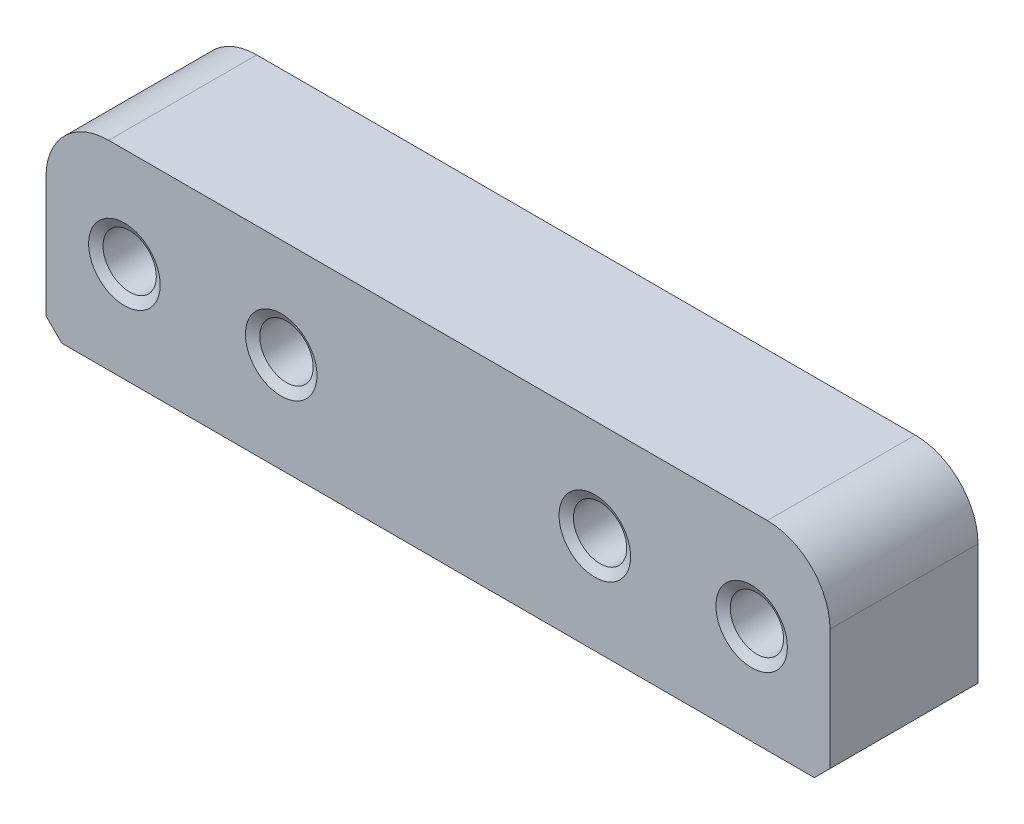
ISO-10303-21;
HEADER;
FILE_DESCRIPTION(('STEP AP214'),'2;1');
FILE_NAME('part.step','',(''),(''),'','','');
FILE_SCHEMA(('AUTOMOTIVE_DESIGN { 1 0 10303 214 1 1 1 1 }'));
ENDSEC;
DATA;
#1=APPLICATION_CONTEXT('core data for automotive mechanical design processes');
#2=APPLICATION_PROTOCOL_DEFINITION('international standard','automotive_design',2000,#1);
#3=PRODUCT_CONTEXT('',#1,'mechanical');
#4=PRODUCT('Part','Part','',(#3));
#5=PRODUCT_RELATED_PRODUCT_CATEGORY('part','',(#4));
#6=PRODUCT_DEFINITION_FORMATION('','',#4);
#7=PRODUCT_DEFINITION_CONTEXT('part definition',#1,'design');
#8=PRODUCT_DEFINITION('design','',#6,#7);
#9=PRODUCT_DEFINITION_SHAPE('','',#8);
#10=(LENGTH_UNIT() NAMED_UNIT(*) SI_UNIT(.MILLI.,.METRE.));
#11=(NAMED_UNIT(*) PLANE_ANGLE_UNIT() SI_UNIT($,.RADIAN.));
#12=(NAMED_UNIT(*) SI_UNIT($,.STERADIAN.) SOLID_ANGLE_UNIT());
#13=UNCERTAINTY_MEASURE_WITH_UNIT(LENGTH_MEASURE(1.E-05),#10,'distance_accuracy_value','');
#14=(GEOMETRIC_REPRESENTATION_CONTEXT(3) GLOBAL_UNCERTAINTY_ASSIGNED_CONTEXT((#13)) GLOBAL_UNIT_ASSIGNED_CONTEXT((#10,
#11,#12)) REPRESENTATION_CONTEXT('',''));
#15=CARTESIAN_POINT('',(0.,0.,0.));
#16=DIRECTION('',(0.,0.,1.));
#17=DIRECTION('',(1.,0.,0.));
#18=AXIS2_PLACEMENT_3D('',#15,#16,#17);
#19=CARTESIAN_POINT('',(476.510652388512,-35.6945033639548,-954.200431195112));
#20=DIRECTION('',(0.,0.,-1.));
#21=DIRECTION('',(-1.,0.,0.));
#22=AXIS2_PLACEMENT_3D('',#19,#20,#21);
#23=PLANE('',#22);
#24=CARTESIAN_POINT('',(456.510652388512,-35.6945033639549,-954.200431195112));
#25=DIRECTION('',(0.,0.,1.));
#26=DIRECTION('',(1.,0.,0.));
#27=AXIS2_PLACEMENT_3D('',#24,#25,#26);
#28=CIRCLE('',#27,3.4);
#29=CARTESIAN_POINT('',(459.910652388512,-35.6945033639549,-954.200431195112));
#30=VERTEX_POINT('',#29);
#31=EDGE_CURVE('E232',#30,#30,#28,.T.);
#32=ORIENTED_EDGE('',*,*,#31,.T.);
#33=EDGE_LOOP('',(#32));
#34=FACE_BOUND('',#33,.T.);
#35=CARTESIAN_POINT('',(456.510652388512,-35.6945033639549,-954.200431195112));
#36=DIRECTION('',(0.,0.,-1.));
#37=DIRECTION('',(-1.,0.,0.));
#38=AXIS2_PLACEMENT_3D('',#35,#36,#37);
#39=CIRCLE('',#38,4.25);
#40=CARTESIAN_POINT('',(452.260652388512,-35.6945033639549,-954.200431195112));
#41=VERTEX_POINT('',#40);
#42=EDGE_CURVE('E240',#41,#41,#39,.T.);
#43=ORIENTED_EDGE('',*,*,#42,.T.);
#44=EDGE_LOOP('',(#43));
#45=FACE_BOUND('',#44,.T.);
#46=ADVANCED_FACE('F17',(#34,#45),#23,.T.);
#47=CARTESIAN_POINT('',(476.510652388512,-35.6945033639548,-954.200431195112));
#48=DIRECTION('',(0.,0.,-1.));
#49=DIRECTION('',(-1.,0.,0.));
#50=AXIS2_PLACEMENT_3D('',#47,#48,#49);
#51=PLANE('',#50);
#52=CARTESIAN_POINT('',(496.510652388511,-35.6945033639549,-954.200431195112));
#53=DIRECTION('',(0.,0.,1.));
#54=DIRECTION('',(1.,0.,0.));
#55=AXIS2_PLACEMENT_3D('',#52,#53,#54);
#56=CIRCLE('',#55,3.4);
#57=CARTESIAN_POINT('',(499.910652388511,-35.6945033639549,-954.200431195112));
#58=VERTEX_POINT('',#57);
#59=EDGE_CURVE('E229',#58,#58,#56,.T.);
#60=ORIENTED_EDGE('',*,*,#59,.T.);
#61=EDGE_LOOP('',(#60));
#62=FACE_BOUND('',#61,.T.);
#63=CARTESIAN_POINT('',(496.510652388511,-35.6945033639549,-954.200431195112));
#64=DIRECTION('',(0.,0.,-1.));
#65=DIRECTION('',(-1.,0.,0.));
#66=AXIS2_PLACEMENT_3D('',#63,#64,#65);
#67=CIRCLE('',#66,4.25);
#68=CARTESIAN_POINT('',(492.260652388511,-35.6945033639549,-954.200431195112));
#69=VERTEX_POINT('',#68);
#70=EDGE_CURVE('E235',#69,#69,#67,.T.);
#71=ORIENTED_EDGE('',*,*,#70,.T.);
#72=EDGE_LOOP('',(#71));
#73=FACE_BOUND('',#72,.T.);
#74=ADVANCED_FACE('F347',(#62,#73),#51,.T.);
#75=CARTESIAN_POINT('',(476.510652388512,-35.6945033639548,-954.200431195112));
#76=DIRECTION('',(0.,0.,-1.));
#77=DIRECTION('',(-1.,0.,0.));
#78=AXIS2_PLACEMENT_3D('',#75,#76,#77);
#79=PLANE('',#78);
#80=CARTESIAN_POINT('',(436.510652388512,-35.6945033639549,-954.200431195112));
#81=DIRECTION('',(0.,0.,1.));
#82=DIRECTION('',(1.,0.,0.));
#83=AXIS2_PLACEMENT_3D('',#80,#81,#82);
#84=CIRCLE('',#83,3.4);
#85=CARTESIAN_POINT('',(439.910652388512,-35.6945033639549,-954.200431195112));
#86=VERTEX_POINT('',#85);
#87=EDGE_CURVE('E226',#86,#86,#84,.T.);
#88=ORIENTED_EDGE('',*,*,#87,.T.);
#89=EDGE_LOOP('',(#88));
#90=FACE_BOUND('',#89,.T.);
#91=CARTESIAN_POINT('',(436.510652388512,-35.6945033639549,-954.200431195112));
#92=DIRECTION('',(0.,0.,-1.));
#93=DIRECTION('',(-1.,0.,0.));
#94=AXIS2_PLACEMENT_3D('',#91,#92,#93);
#95=CIRCLE('',#94,4.25);
#96=CARTESIAN_POINT('',(432.260652388512,-35.6945033639549,-954.200431195112));
#97=VERTEX_POINT('',#96);
#98=EDGE_CURVE('E238',#97,#97,#95,.T.);
#99=ORIENTED_EDGE('',*,*,#98,.T.);
#100=EDGE_LOOP('',(#99));
#101=FACE_BOUND('',#100,.T.);
#102=ADVANCED_FACE('F262',(#90,#101),#79,.T.);
#103=CARTESIAN_POINT('',(476.510652388512,-35.6945033639548,-954.200431195112));
#104=DIRECTION('',(0.,0.,-1.));
#105=DIRECTION('',(-1.,0.,0.));
#106=AXIS2_PLACEMENT_3D('',#103,#104,#105);
#107=PLANE('',#106);
#108=CARTESIAN_POINT('',(516.510652388511,-35.6945033639549,-954.200431195112));
#109=DIRECTION('',(0.,0.,1.));
#110=DIRECTION('',(1.,0.,0.));
#111=AXIS2_PLACEMENT_3D('',#108,#109,#110);
#112=CIRCLE('',#111,3.4);
#113=CARTESIAN_POINT('',(519.910652388511,-35.6945033639549,-954.200431195112));
#114=VERTEX_POINT('',#113);
#115=EDGE_CURVE('E223',#114,#114,#112,.T.);
#116=ORIENTED_EDGE('',*,*,#115,.T.);
#117=EDGE_LOOP('',(#116));
#118=FACE_BOUND('',#117,.T.);
#119=CARTESIAN_POINT('',(516.510652388511,-35.6945033639549,-954.200431195112));
#120=DIRECTION('',(0.,0.,-1.));
#121=DIRECTION('',(-1.,0.,0.));
#122=AXIS2_PLACEMENT_3D('',#119,#120,#121);
#123=CIRCLE('',#122,4.25);
#124=CARTESIAN_POINT('',(512.260652388511,-35.6945033639549,-954.200431195112));
#125=VERTEX_POINT('',#124);
#126=EDGE_CURVE('E20',#125,#125,#123,.T.);
#127=ORIENTED_EDGE('',*,*,#126,.T.);
#128=EDGE_LOOP('',(#127));
#129=FACE_BOUND('',#128,.T.);
#130=ADVANCED_FACE('F247',(#118,#129),#107,.T.);
#131=CARTESIAN_POINT('',(516.510652388511,-35.6945033639549,-965.200431195112));
#132=DIRECTION('',(0.,0.,-1.));
#133=DIRECTION('',(-1.,0.,0.));
#134=AXIS2_PLACEMENT_3D('',#131,#132,#133);
#135=CYLINDRICAL_SURFACE('',#134,4.25);
#136=CARTESIAN_POINT('',(516.510652388511,-35.6945033639549,-965.200431195112));
#137=DIRECTION('',(0.,0.,-1.));
#138=DIRECTION('',(-1.,0.,0.));
#139=AXIS2_PLACEMENT_3D('',#136,#137,#138);
#140=CIRCLE('',#139,4.25);
#141=CARTESIAN_POINT('',(512.260652388511,-35.6945033639549,-965.200431195112));
#142=VERTEX_POINT('',#141);
#143=EDGE_CURVE('E220',#142,#142,#140,.T.);
#144=ORIENTED_EDGE('',*,*,#143,.T.);
#145=EDGE_LOOP('',(#144));
#146=FACE_BOUND('',#145,.T.);
#147=ORIENTED_EDGE('',*,*,#126,.F.);
#148=EDGE_LOOP('',(#147));
#149=FACE_BOUND('',#148,.T.);
#150=ADVANCED_FACE('F249',(#146,#149),#135,.F.);
#151=CARTESIAN_POINT('',(456.510652388512,-35.6945033639549,-965.200431195112));
#152=DIRECTION('',(0.,0.,-1.));
#153=DIRECTION('',(-1.,0.,0.));
#154=AXIS2_PLACEMENT_3D('',#151,#152,#153);
#155=CYLINDRICAL_SURFACE('',#154,4.25);
#156=CARTESIAN_POINT('',(456.510652388512,-35.6945033639549,-965.200431195112));
#157=DIRECTION('',(0.,0.,-1.));
#158=DIRECTION('',(-1.,0.,0.));
#159=AXIS2_PLACEMENT_3D('',#156,#157,#158);
#160=CIRCLE('',#159,4.25);
#161=CARTESIAN_POINT('',(452.260652388512,-35.6945033639549,-965.200431195112));
#162=VERTEX_POINT('',#161);
#163=EDGE_CURVE('E217',#162,#162,#160,.T.);
#164=ORIENTED_EDGE('',*,*,#163,.T.);
#165=EDGE_LOOP('',(#164));
#166=FACE_BOUND('',#165,.T.);
#167=ORIENTED_EDGE('',*,*,#42,.F.);
#168=EDGE_LOOP('',(#167));
#169=FACE_BOUND('',#168,.T.);
#170=ADVANCED_FACE('F251',(#166,#169),#155,.F.);
#171=CARTESIAN_POINT('',(436.510652388512,-35.6945033639549,-965.200431195112));
#172=DIRECTION('',(0.,0.,-1.));
#173=DIRECTION('',(-1.,0.,0.));
#174=AXIS2_PLACEMENT_3D('',#171,#172,#173);
#175=CYLINDRICAL_SURFACE('',#174,4.25);
#176=CARTESIAN_POINT('',(436.510652388512,-35.6945033639549,-965.200431195112));
#177=DIRECTION('',(0.,0.,-1.));
#178=DIRECTION('',(-1.,0.,0.));
#179=AXIS2_PLACEMENT_3D('',#176,#177,#178);
#180=CIRCLE('',#179,4.25);
#181=CARTESIAN_POINT('',(432.260652388512,-35.6945033639549,-965.200431195112));
#182=VERTEX_POINT('',#181);
#183=EDGE_CURVE('E214',#182,#182,#180,.T.);
#184=ORIENTED_EDGE('',*,*,#183,.T.);
#185=EDGE_LOOP('',(#184));
#186=FACE_BOUND('',#185,.T.);
#187=ORIENTED_EDGE('',*,*,#98,.F.);
#188=EDGE_LOOP('',(#187));
#189=FACE_BOUND('',#188,.T.);
#190=ADVANCED_FACE('F259',(#186,#189),#175,.F.);
#191=CARTESIAN_POINT('',(496.510652388511,-35.6945033639549,-965.200431195112));
#192=DIRECTION('',(0.,0.,-1.));
#193=DIRECTION('',(-1.,0.,0.));
#194=AXIS2_PLACEMENT_3D('',#191,#192,#193);
#195=CYLINDRICAL_SURFACE('',#194,4.25);
#196=CARTESIAN_POINT('',(496.510652388511,-35.6945033639549,-965.200431195112));
#197=DIRECTION('',(0.,0.,-1.));
#198=DIRECTION('',(-1.,0.,0.));
#199=AXIS2_PLACEMENT_3D('',#196,#197,#198);
#200=CIRCLE('',#199,4.25);
#201=CARTESIAN_POINT('',(492.260652388511,-35.6945033639549,-965.200431195112));
#202=VERTEX_POINT('',#201);
#203=EDGE_CURVE('E173',#202,#202,#200,.T.);
#204=ORIENTED_EDGE('',*,*,#203,.T.);
#205=EDGE_LOOP('',(#204));
#206=FACE_BOUND('',#205,.T.);
#207=ORIENTED_EDGE('',*,*,#70,.F.);
#208=EDGE_LOOP('',(#207));
#209=FACE_BOUND('',#208,.T.);
#210=ADVANCED_FACE('F333',(#206,#209),#195,.F.);
#211=CARTESIAN_POINT('',(456.510652388512,-35.6945033639549,-949.325431195112));
#212=DIRECTION('',(0.,0.,1.));
#213=DIRECTION('',(1.,0.,0.));
#214=AXIS2_PLACEMENT_3D('',#211,#212,#213);
#215=CYLINDRICAL_SURFACE('',#214,3.4);
#216=CARTESIAN_POINT('',(456.510652388512,-35.6945033639549,-946.99660088304));
#217=DIRECTION('',(0.,0.,1.));
#218=DIRECTION('',(0.,1.,0.));
#219=AXIS2_PLACEMENT_3D('',#216,#217,#218);
#220=CIRCLE('',#219,3.39999999998369);
#221=CARTESIAN_POINT('',(456.510652388512,-32.2945033639712,-946.99660088304));
#222=VERTEX_POINT('',#221);
#223=EDGE_CURVE('E172',#222,#222,#220,.T.);
#224=ORIENTED_EDGE('',*,*,#223,.T.);
#225=EDGE_LOOP('',(#224));
#226=FACE_BOUND('',#225,.T.);
#227=ORIENTED_EDGE('',*,*,#31,.F.);
#228=EDGE_LOOP('',(#227));
#229=FACE_BOUND('',#228,.T.);
#230=ADVANCED_FACE('F329',(#226,#229),#215,.F.);
#231=CARTESIAN_POINT('',(496.510652388511,-35.6945033639549,-949.325431195112));
#232=DIRECTION('',(0.,0.,1.));
#233=DIRECTION('',(1.,0.,0.));
#234=AXIS2_PLACEMENT_3D('',#231,#232,#233);
#235=CYLINDRICAL_SURFACE('',#234,3.4);
#236=CARTESIAN_POINT('',(496.510652388511,-35.6945033639549,-946.99660088304));
#237=DIRECTION('',(0.,0.,1.));
#238=DIRECTION('',(0.,1.,0.));
#239=AXIS2_PLACEMENT_3D('',#236,#237,#238);
#240=CIRCLE('',#239,3.39999999998369);
#241=CARTESIAN_POINT('',(496.510652388511,-32.2945033639712,-946.99660088304));
#242=VERTEX_POINT('',#241);
#243=EDGE_CURVE('E192',#242,#242,#240,.T.);
#244=ORIENTED_EDGE('',*,*,#243,.T.);
#245=EDGE_LOOP('',(#244));
#246=FACE_BOUND('',#245,.T.);
#247=ORIENTED_EDGE('',*,*,#59,.F.);
#248=EDGE_LOOP('',(#247));
#249=FACE_BOUND('',#248,.T.);
#250=ADVANCED_FACE('F325',(#246,#249),#235,.F.);
#251=CARTESIAN_POINT('',(436.510652388512,-35.6945033639549,-949.325431195112));
#252=DIRECTION('',(0.,0.,1.));
#253=DIRECTION('',(1.,0.,0.));
#254=AXIS2_PLACEMENT_3D('',#251,#252,#253);
#255=CYLINDRICAL_SURFACE('',#254,3.4);
#256=CARTESIAN_POINT('',(436.510652388512,-35.6945033639549,-946.99660088304));
#257=DIRECTION('',(0.,0.,1.));
#258=DIRECTION('',(0.,1.,0.));
#259=AXIS2_PLACEMENT_3D('',#256,#257,#258);
#260=CIRCLE('',#259,3.39999999998369);
#261=CARTESIAN_POINT('',(436.510652388512,-32.2945033639712,-946.99660088304));
#262=VERTEX_POINT('',#261);
#263=EDGE_CURVE('E189',#262,#262,#260,.T.);
#264=ORIENTED_EDGE('',*,*,#263,.T.);
#265=EDGE_LOOP('',(#264));
#266=FACE_BOUND('',#265,.T.);
#267=ORIENTED_EDGE('',*,*,#87,.F.);
#268=EDGE_LOOP('',(#267));
#269=FACE_BOUND('',#268,.T.);
#270=ADVANCED_FACE('F321',(#266,#269),#255,.F.);
#271=CARTESIAN_POINT('',(516.510652388511,-35.6945033639549,-949.325431195112));
#272=DIRECTION('',(0.,0.,1.));
#273=DIRECTION('',(1.,0.,0.));
#274=AXIS2_PLACEMENT_3D('',#271,#272,#273);
#275=CYLINDRICAL_SURFACE('',#274,3.4);
#276=CARTESIAN_POINT('',(516.510652388511,-35.6945033639549,-946.99660088304));
#277=DIRECTION('',(0.,0.,1.));
#278=DIRECTION('',(0.,1.,0.));
#279=AXIS2_PLACEMENT_3D('',#276,#277,#278);
#280=CIRCLE('',#279,3.39999999998369);
#281=CARTESIAN_POINT('',(516.510652388511,-32.2945033639712,-946.99660088304));
#282=VERTEX_POINT('',#281);
#283=EDGE_CURVE('E186',#282,#282,#280,.T.);
#284=ORIENTED_EDGE('',*,*,#283,.T.);
#285=EDGE_LOOP('',(#284));
#286=FACE_BOUND('',#285,.T.);
#287=ORIENTED_EDGE('',*,*,#115,.F.);
#288=EDGE_LOOP('',(#287));
#289=FACE_BOUND('',#288,.T.);
#290=ADVANCED_FACE('F318',(#286,#289),#275,.F.);
#291=CARTESIAN_POINT('',(476.510652388512,-47.3945033639549,-964.200431195112));
#292=DIRECTION('',(0.,0.707106781186548,0.707106781186548));
#293=DIRECTION('',(0.,-0.707106781186548,0.707106781186548));
#294=AXIS2_PLACEMENT_3D('',#291,#292,#293);
#295=PLANE('',#294);
#296=DIRECTION('',(-0.577350269189626,0.577350269189626,-0.577350269189626));
#297=VECTOR('',#296,1.);
#298=CARTESIAN_POINT('',(428.510652388512,-48.3945033639549,-963.200431195112));
#299=LINE('',#298,#297);
#300=CARTESIAN_POINT('',(428.510652388512,-48.3945033639549,-963.200431195112));
#301=VERTEX_POINT('',#300);
#302=CARTESIAN_POINT('',(426.510652388512,-46.3945033639549,-965.200431195112));
#303=VERTEX_POINT('',#302);
#304=EDGE_CURVE('E150',#301,#303,#299,.T.);
#305=ORIENTED_EDGE('',*,*,#304,.T.);
#306=DIRECTION('',(1.,0.,0.));
#307=VECTOR('',#306,1.);
#308=CARTESIAN_POINT('',(526.510652388511,-46.3945033639549,-965.200431195112));
#309=LINE('',#308,#307);
#310=CARTESIAN_POINT('',(526.510652388511,-46.3945033639549,-965.200431195112));
#311=VERTEX_POINT('',#310);
#312=EDGE_CURVE('E68',#303,#311,#309,.T.);
#313=ORIENTED_EDGE('',*,*,#312,.T.);
#314=DIRECTION('',(0.577350269189626,0.577350269189626,-0.577350269189626));
#315=VECTOR('',#314,1.);
#316=CARTESIAN_POINT('',(524.510652388511,-48.3945033639549,-963.200431195112));
#317=LINE('',#316,#315);
#318=CARTESIAN_POINT('',(524.510652388511,-48.3945033639549,-963.200431195112));
#319=VERTEX_POINT('',#318);
#320=EDGE_CURVE('E100',#319,#311,#317,.T.);
#321=ORIENTED_EDGE('',*,*,#320,.F.);
#322=DIRECTION('',(1.,0.,0.));
#323=VECTOR('',#322,1.);
#324=CARTESIAN_POINT('',(526.510652388511,-48.3945033639549,-963.200431195112));
#325=LINE('',#324,#323);
#326=EDGE_CURVE('E78',#319,#301,#325,.F.);
#327=ORIENTED_EDGE('',*,*,#326,.T.);
#328=EDGE_LOOP('',(#305,#313,#321,#327));
#329=FACE_BOUND('',#328,.T.);
#330=ADVANCED_FACE('F315',(#329),#295,.F.);
#331=CARTESIAN_POINT('',(526.510652388511,-32.0145033639548,-965.200431195112));
#332=DIRECTION('',(0.,0.,1.));
#333=DIRECTION('',(1.,0.,0.));
#334=AXIS2_PLACEMENT_3D('',#331,#332,#333);
#335=PLANE('',#334);
#336=CARTESIAN_POINT('',(518.510652388511,-30.9945033639549,-965.200431195112));
#337=DIRECTION('',(0.,0.,1.));
#338=DIRECTION('',(1.,0.,0.));
#339=AXIS2_PLACEMENT_3D('',#336,#337,#338);
#340=CIRCLE('',#339,8.);
#341=CARTESIAN_POINT('',(526.510652388511,-30.9945033639549,-965.200431195112));
#342=VERTEX_POINT('',#341);
#343=CARTESIAN_POINT('',(518.510652388511,-22.9945033639549,-965.200431195112));
#344=VERTEX_POINT('',#343);
#345=EDGE_CURVE('E183',#342,#344,#340,.T.);
#346=ORIENTED_EDGE('',*,*,#345,.F.);
#347=DIRECTION('',(0.,1.,0.));
#348=VECTOR('',#347,1.);
#349=CARTESIAN_POINT('',(526.510652388511,-40.8645033639548,-965.200431195112));
#350=LINE('',#349,#348);
#351=EDGE_CURVE('E59',#311,#342,#350,.T.);
#352=ORIENTED_EDGE('',*,*,#351,.F.);
#353=ORIENTED_EDGE('',*,*,#312,.F.);
#354=DIRECTION('',(0.,1.,0.));
#355=VECTOR('',#354,1.);
#356=CARTESIAN_POINT('',(426.510652388512,-40.8645033639548,-965.200431195112));
#357=LINE('',#356,#355);
#358=CARTESIAN_POINT('',(426.510652388512,-30.9945033639549,-965.200431195112));
#359=VERTEX_POINT('',#358);
#360=EDGE_CURVE('E138',#303,#359,#357,.T.);
#361=ORIENTED_EDGE('',*,*,#360,.T.);
#362=CARTESIAN_POINT('',(434.510652388512,-30.9945033639549,-965.200431195112));
#363=DIRECTION('',(0.,0.,1.));
#364=DIRECTION('',(1.,0.,0.));
#365=AXIS2_PLACEMENT_3D('',#362,#363,#364);
#366=CIRCLE('',#365,8.);
#367=CARTESIAN_POINT('',(434.510652388512,-22.9945033639549,-965.200431195112));
#368=VERTEX_POINT('',#367);
#369=EDGE_CURVE('E134',#368,#359,#366,.T.);
#370=ORIENTED_EDGE('',*,*,#369,.F.);
#371=DIRECTION('',(1.,0.,0.));
#372=VECTOR('',#371,1.);
#373=CARTESIAN_POINT('',(451.510652388512,-22.9945033639549,-965.200431195112));
#374=LINE('',#373,#372);
#375=EDGE_CURVE('E128',#344,#368,#374,.F.);
#376=ORIENTED_EDGE('',*,*,#375,.F.);
#377=EDGE_LOOP('',(#346,#352,#353,#361,#370,#376));
#378=FACE_BOUND('',#377,.T.);
#379=ORIENTED_EDGE('',*,*,#203,.F.);
#380=EDGE_LOOP('',(#379));
#381=FACE_BOUND('',#380,.T.);
#382=ORIENTED_EDGE('',*,*,#183,.F.);
#383=EDGE_LOOP('',(#382));
#384=FACE_BOUND('',#383,.T.);
#385=ORIENTED_EDGE('',*,*,#163,.F.);
#386=EDGE_LOOP('',(#385));
#387=FACE_BOUND('',#386,.T.);
#388=ORIENTED_EDGE('',*,*,#143,.F.);
#389=EDGE_LOOP('',(#388));
#390=FACE_BOUND('',#389,.T.);
#391=ADVANCED_FACE('F311',(#378,#381,#384,#387,#390),#335,.F.);
#392=CARTESIAN_POINT('',(456.510652388512,-35.6945033639549,-946.325431195078));
#393=DIRECTION('',(0.,0.,1.));
#394=DIRECTION('',(1.,0.,0.));
#395=AXIS2_PLACEMENT_3D('',#392,#393,#394);
#396=CONICAL_SURFACE('',#395,4.56250000006136,1.04719755120111);
#397=CARTESIAN_POINT('',(456.510652388512,-35.6945033639549,-946.325431195167));
#398=DIRECTION('',(0.,0.,1.));
#399=DIRECTION('',(1.,0.,0.));
#400=AXIS2_PLACEMENT_3D('',#397,#398,#399);
#401=CIRCLE('',#400,4.56249999990632);
#402=CARTESIAN_POINT('',(461.073152388418,-35.6945033639549,-946.325431195167));
#403=VERTEX_POINT('',#402);
#404=EDGE_CURVE('E131',#403,#403,#401,.T.);
#405=ORIENTED_EDGE('',*,*,#404,.T.);
#406=EDGE_LOOP('',(#405));
#407=FACE_BOUND('',#406,.T.);
#408=ORIENTED_EDGE('',*,*,#223,.F.);
#409=EDGE_LOOP('',(#408));
#410=FACE_BOUND('',#409,.T.);
#411=ADVANCED_FACE('F307',(#407,#410),#396,.F.);
#412=CARTESIAN_POINT('',(496.510652388511,-35.6945033639549,-946.325431195078));
#413=DIRECTION('',(0.,0.,1.));
#414=DIRECTION('',(1.,0.,0.));
#415=AXIS2_PLACEMENT_3D('',#412,#413,#414);
#416=CONICAL_SURFACE('',#415,4.56250000006136,1.04719755120111);
#417=CARTESIAN_POINT('',(496.510652388511,-35.6945033639549,-946.325431195167));
#418=DIRECTION('',(0.,0.,1.));
#419=DIRECTION('',(1.,0.,0.));
#420=AXIS2_PLACEMENT_3D('',#417,#418,#419);
#421=CIRCLE('',#420,4.56249999990632);
#422=CARTESIAN_POINT('',(501.073152388417,-35.6945033639549,-946.325431195167));
#423=VERTEX_POINT('',#422);
#424=EDGE_CURVE('E204',#423,#423,#421,.T.);
#425=ORIENTED_EDGE('',*,*,#424,.T.);
#426=EDGE_LOOP('',(#425));
#427=FACE_BOUND('',#426,.T.);
#428=ORIENTED_EDGE('',*,*,#243,.F.);
#429=EDGE_LOOP('',(#428));
#430=FACE_BOUND('',#429,.T.);
#431=ADVANCED_FACE('F303',(#427,#430),#416,.F.);
#432=CARTESIAN_POINT('',(436.510652388512,-35.6945033639549,-946.325431195078));
#433=DIRECTION('',(0.,0.,1.));
#434=DIRECTION('',(1.,0.,0.));
#435=AXIS2_PLACEMENT_3D('',#432,#433,#434);
#436=CONICAL_SURFACE('',#435,4.56250000006136,1.04719755120111);
#437=CARTESIAN_POINT('',(436.510652388512,-35.6945033639549,-946.325431195167));
#438=DIRECTION('',(0.,0.,1.));
#439=DIRECTION('',(1.,0.,0.));
#440=AXIS2_PLACEMENT_3D('',#437,#438,#439);
#441=CIRCLE('',#440,4.56249999990632);
#442=CARTESIAN_POINT('',(441.073152388418,-35.6945033639549,-946.325431195167));
#443=VERTEX_POINT('',#442);
#444=EDGE_CURVE('E201',#443,#443,#441,.T.);
#445=ORIENTED_EDGE('',*,*,#444,.T.);
#446=EDGE_LOOP('',(#445));
#447=FACE_BOUND('',#446,.T.);
#448=ORIENTED_EDGE('',*,*,#263,.F.);
#449=EDGE_LOOP('',(#448));
#450=FACE_BOUND('',#449,.T.);
#451=ADVANCED_FACE('F299',(#447,#450),#436,.F.);
#452=CARTESIAN_POINT('',(516.510652388511,-35.6945033639549,-946.325431195078));
#453=DIRECTION('',(0.,0.,1.));
#454=DIRECTION('',(1.,0.,0.));
#455=AXIS2_PLACEMENT_3D('',#452,#453,#454);
#456=CONICAL_SURFACE('',#455,4.56250000006136,1.04719755120111);
#457=CARTESIAN_POINT('',(516.510652388511,-35.6945033639549,-946.325431195167));
#458=DIRECTION('',(0.,0.,1.));
#459=DIRECTION('',(1.,0.,0.));
#460=AXIS2_PLACEMENT_3D('',#457,#458,#459);
#461=CIRCLE('',#460,4.56249999990632);
#462=CARTESIAN_POINT('',(521.073152388417,-35.6945033639549,-946.325431195167));
#463=VERTEX_POINT('',#462);
#464=EDGE_CURVE('E118',#463,#463,#461,.T.);
#465=ORIENTED_EDGE('',*,*,#464,.T.);
#466=EDGE_LOOP('',(#465));
#467=FACE_BOUND('',#466,.T.);
#468=ORIENTED_EDGE('',*,*,#283,.F.);
#469=EDGE_LOOP('',(#468));
#470=FACE_BOUND('',#469,.T.);
#471=ADVANCED_FACE('F295',(#467,#470),#456,.F.);
#472=CARTESIAN_POINT('',(518.510652388511,-30.9945033639549,-966.590431195112));
#473=DIRECTION('',(0.,0.,1.));
#474=DIRECTION('',(1.,0.,0.));
#475=AXIS2_PLACEMENT_3D('',#472,#473,#474);
#476=CYLINDRICAL_SURFACE('',#475,8.);
#477=CARTESIAN_POINT('',(518.510652388511,-30.9945033639549,-946.325431195112));
#478=DIRECTION('',(0.,0.,1.));
#479=DIRECTION('',(1.,0.,0.));
#480=AXIS2_PLACEMENT_3D('',#477,#478,#479);
#481=CIRCLE('',#480,8.);
#482=CARTESIAN_POINT('',(518.510652388511,-22.9945033639549,-946.325431195112));
#483=VERTEX_POINT('',#482);
#484=CARTESIAN_POINT('',(526.510652388511,-30.9945033639549,-946.325431195112));
#485=VERTEX_POINT('',#484);
#486=EDGE_CURVE('E116',#483,#485,#481,.F.);
#487=ORIENTED_EDGE('',*,*,#486,.T.);
#488=DIRECTION('',(0.,0.,-1.));
#489=VECTOR('',#488,1.);
#490=CARTESIAN_POINT('',(526.510652388511,-30.9945033639549,-966.590431195112));
#491=LINE('',#490,#489);
#492=EDGE_CURVE('E102',#342,#485,#491,.F.);
#493=ORIENTED_EDGE('',*,*,#492,.F.);
#494=ORIENTED_EDGE('',*,*,#345,.T.);
#495=DIRECTION('',(0.,0.,1.));
#496=VECTOR('',#495,1.);
#497=CARTESIAN_POINT('',(518.510652388511,-22.9945033639549,-975.200431195112));
#498=LINE('',#497,#496);
#499=EDGE_CURVE('E127',#483,#344,#498,.F.);
#500=ORIENTED_EDGE('',*,*,#499,.F.);
#501=EDGE_LOOP('',(#487,#493,#494,#500));
#502=FACE_BOUND('',#501,.T.);
#503=ADVANCED_FACE('F292',(#502),#476,.T.);
#504=CARTESIAN_POINT('',(526.510652388511,-40.8645033639548,-966.590431195112));
#505=DIRECTION('',(1.,0.,0.));
#506=DIRECTION('',(0.,0.,-1.));
#507=AXIS2_PLACEMENT_3D('',#504,#505,#506);
#508=PLANE('',#507);
#509=ORIENTED_EDGE('',*,*,#492,.T.);
#510=DIRECTION('',(0.,1.,0.));
#511=VECTOR('',#510,1.);
#512=CARTESIAN_POINT('',(526.510652388511,-51.0645033639548,-946.325431195112));
#513=LINE('',#512,#511);
#514=CARTESIAN_POINT('',(526.510652388511,-46.3945033639549,-946.325431195112));
#515=VERTEX_POINT('',#514);
#516=EDGE_CURVE('E109',#485,#515,#513,.F.);
#517=ORIENTED_EDGE('',*,*,#516,.T.);
#518=DIRECTION('',(0.,0.,1.));
#519=VECTOR('',#518,1.);
#520=CARTESIAN_POINT('',(526.510652388511,-46.3945033639549,-954.762931195112));
#521=LINE('',#520,#519);
#522=EDGE_CURVE('E96',#311,#515,#521,.T.);
#523=ORIENTED_EDGE('',*,*,#522,.F.);
#524=ORIENTED_EDGE('',*,*,#351,.T.);
#525=EDGE_LOOP('',(#509,#517,#523,#524));
#526=FACE_BOUND('',#525,.T.);
#527=ADVANCED_FACE('F114',(#526),#508,.T.);
#528=CARTESIAN_POINT('',(525.510652388511,-47.3945033639549,-954.762931195112));
#529=DIRECTION('',(0.707106781186548,-0.707106781186548,0.));
#530=DIRECTION('',(0.707106781186548,0.707106781186548,0.));
#531=AXIS2_PLACEMENT_3D('',#528,#529,#530);
#532=PLANE('',#531);
#533=DIRECTION('',(0.,0.,1.));
#534=VECTOR('',#533,1.);
#535=CARTESIAN_POINT('',(524.510652388511,-48.3945033639549,-965.200431195112));
#536=LINE('',#535,#534);
#537=CARTESIAN_POINT('',(524.510652388511,-48.3945033639549,-946.325431195112));
#538=VERTEX_POINT('',#537);
#539=EDGE_CURVE('E89',#538,#319,#536,.F.);
#540=ORIENTED_EDGE('',*,*,#539,.T.);
#541=ORIENTED_EDGE('',*,*,#320,.T.);
#542=ORIENTED_EDGE('',*,*,#522,.T.);
#543=DIRECTION('',(-0.707106781186547,-0.707106781186547,0.));
#544=VECTOR('',#543,1.);
#545=CARTESIAN_POINT('',(526.510652388511,-46.3945033639549,-946.325431195112));
#546=LINE('',#545,#544);
#547=EDGE_CURVE('E99',#515,#538,#546,.T.);
#548=ORIENTED_EDGE('',*,*,#547,.T.);
#549=EDGE_LOOP('',(#540,#541,#542,#548));
#550=FACE_BOUND('',#549,.T.);
#551=ADVANCED_FACE('F98',(#550),#532,.T.);
#552=CARTESIAN_POINT('',(526.510652388511,-48.3945033639549,-965.200431195112));
#553=DIRECTION('',(0.,1.,0.));
#554=DIRECTION('',(0.,0.,1.));
#555=AXIS2_PLACEMENT_3D('',#552,#553,#554);
#556=PLANE('',#555);
#557=ORIENTED_EDGE('',*,*,#539,.F.);
#558=DIRECTION('',(-1.,0.,0.));
#559=VECTOR('',#558,1.);
#560=CARTESIAN_POINT('',(526.510652388511,-48.3945033639549,-946.325431195112));
#561=LINE('',#560,#559);
#562=CARTESIAN_POINT('',(428.510652388512,-48.3945033639549,-946.325431195112));
#563=VERTEX_POINT('',#562);
#564=EDGE_CURVE('E112',#538,#563,#561,.T.);
#565=ORIENTED_EDGE('',*,*,#564,.T.);
#566=DIRECTION('',(0.,0.,1.));
#567=VECTOR('',#566,1.);
#568=CARTESIAN_POINT('',(428.510652388512,-48.3945033639548,-954.762931195112));
#569=LINE('',#568,#567);
#570=EDGE_CURVE('E147',#563,#301,#569,.F.);
#571=ORIENTED_EDGE('',*,*,#570,.T.);
#572=ORIENTED_EDGE('',*,*,#326,.F.);
#573=EDGE_LOOP('',(#557,#565,#571,#572));
#574=FACE_BOUND('',#573,.T.);
#575=ADVANCED_FACE('F284',(#574),#556,.F.);
#576=CARTESIAN_POINT('',(427.510652388512,-47.3945033639549,-954.762931195112));
#577=DIRECTION('',(0.707106781186548,0.707106781186548,0.));
#578=DIRECTION('',(-0.707106781186548,0.707106781186548,0.));
#579=AXIS2_PLACEMENT_3D('',#576,#577,#578);
#580=PLANE('',#579);
#581=ORIENTED_EDGE('',*,*,#304,.F.);
#582=ORIENTED_EDGE('',*,*,#570,.F.);
#583=DIRECTION('',(-0.707106781186566,0.707106781186529,0.));
#584=VECTOR('',#583,1.);
#585=CARTESIAN_POINT('',(428.510652388512,-48.3945033639548,-946.325431195112));
#586=LINE('',#585,#584);
#587=CARTESIAN_POINT('',(426.510652388512,-46.3945033639549,-946.325431195112));
#588=VERTEX_POINT('',#587);
#589=EDGE_CURVE('E141',#563,#588,#586,.T.);
#590=ORIENTED_EDGE('',*,*,#589,.T.);
#591=DIRECTION('',(0.,0.,-1.));
#592=VECTOR('',#591,1.);
#593=CARTESIAN_POINT('',(426.510652388512,-46.3945033639549,-966.590431195112));
#594=LINE('',#593,#592);
#595=EDGE_CURVE('E135',#588,#303,#594,.T.);
#596=ORIENTED_EDGE('',*,*,#595,.T.);
#597=EDGE_LOOP('',(#581,#582,#590,#596));
#598=FACE_BOUND('',#597,.T.);
#599=ADVANCED_FACE('F280',(#598),#580,.F.);
#600=CARTESIAN_POINT('',(426.510652388512,-40.8645033639548,-966.590431195112));
#601=DIRECTION('',(1.,0.,0.));
#602=DIRECTION('',(0.,0.,-1.));
#603=AXIS2_PLACEMENT_3D('',#600,#601,#602);
#604=PLANE('',#603);
#605=DIRECTION('',(0.,1.,0.));
#606=VECTOR('',#605,1.);
#607=CARTESIAN_POINT('',(426.510652388512,-51.0645033639548,-946.325431195112));
#608=LINE('',#607,#606);
#609=CARTESIAN_POINT('',(426.510652388512,-30.9945033639549,-946.325431195112));
#610=VERTEX_POINT('',#609);
#611=EDGE_CURVE('E144',#588,#610,#608,.T.);
#612=ORIENTED_EDGE('',*,*,#611,.T.);
#613=DIRECTION('',(0.,0.,1.));
#614=VECTOR('',#613,1.);
#615=CARTESIAN_POINT('',(426.510652388512,-30.9945033639549,-966.590431195112));
#616=LINE('',#615,#614);
#617=EDGE_CURVE('E132',#359,#610,#616,.T.);
#618=ORIENTED_EDGE('',*,*,#617,.F.);
#619=ORIENTED_EDGE('',*,*,#360,.F.);
#620=ORIENTED_EDGE('',*,*,#595,.F.);
#621=EDGE_LOOP('',(#612,#618,#619,#620));
#622=FACE_BOUND('',#621,.T.);
#623=ADVANCED_FACE('F276',(#622),#604,.F.);
#624=CARTESIAN_POINT('',(434.510652388512,-30.9945033639549,-966.590431195112));
#625=DIRECTION('',(0.,0.,1.));
#626=DIRECTION('',(1.,0.,0.));
#627=AXIS2_PLACEMENT_3D('',#624,#625,#626);
#628=CYLINDRICAL_SURFACE('',#627,8.);
#629=CARTESIAN_POINT('',(434.510652388512,-30.9945033639549,-946.325431195112));
#630=DIRECTION('',(0.,0.,1.));
#631=DIRECTION('',(1.,0.,0.));
#632=AXIS2_PLACEMENT_3D('',#629,#630,#631);
#633=CIRCLE('',#632,8.);
#634=CARTESIAN_POINT('',(434.510652388512,-22.9945033639549,-946.325431195112));
#635=VERTEX_POINT('',#634);
#636=EDGE_CURVE('E26',#610,#635,#633,.F.);
#637=ORIENTED_EDGE('',*,*,#636,.T.);
#638=DIRECTION('',(0.,0.,1.));
#639=VECTOR('',#638,1.);
#640=CARTESIAN_POINT('',(434.510652388512,-22.9945033639549,-975.200431195112));
#641=LINE('',#640,#639);
#642=EDGE_CURVE('E34',#368,#635,#641,.T.);
#643=ORIENTED_EDGE('',*,*,#642,.F.);
#644=ORIENTED_EDGE('',*,*,#369,.T.);
#645=ORIENTED_EDGE('',*,*,#617,.T.);
#646=EDGE_LOOP('',(#637,#643,#644,#645));
#647=FACE_BOUND('',#646,.T.);
#648=ADVANCED_FACE('F271',(#647),#628,.T.);
#649=CARTESIAN_POINT('',(451.510652388512,-22.9945033639549,-975.200431195112));
#650=DIRECTION('',(0.,1.,0.));
#651=DIRECTION('',(0.,0.,1.));
#652=AXIS2_PLACEMENT_3D('',#649,#650,#651);
#653=PLANE('',#652);
#654=DIRECTION('',(-1.,0.,0.));
#655=VECTOR('',#654,1.);
#656=CARTESIAN_POINT('',(526.510652388511,-22.9945033639549,-946.325431195112));
#657=LINE('',#656,#655);
#658=EDGE_CURVE('E11',#635,#483,#657,.F.);
#659=ORIENTED_EDGE('',*,*,#658,.T.);
#660=ORIENTED_EDGE('',*,*,#499,.T.);
#661=ORIENTED_EDGE('',*,*,#375,.T.);
#662=ORIENTED_EDGE('',*,*,#642,.T.);
#663=EDGE_LOOP('',(#659,#660,#661,#662));
#664=FACE_BOUND('',#663,.T.);
#665=ADVANCED_FACE('F266',(#664),#653,.T.);
#666=CARTESIAN_POINT('',(526.510652388511,-51.0645033639548,-946.325431195112));
#667=DIRECTION('',(0.,0.,-1.));
#668=DIRECTION('',(-1.,0.,0.));
#669=AXIS2_PLACEMENT_3D('',#666,#667,#668);
#670=PLANE('',#669);
#671=ORIENTED_EDGE('',*,*,#636,.F.);
#672=ORIENTED_EDGE('',*,*,#611,.F.);
#673=ORIENTED_EDGE('',*,*,#589,.F.);
#674=ORIENTED_EDGE('',*,*,#564,.F.);
#675=ORIENTED_EDGE('',*,*,#547,.F.);
#676=ORIENTED_EDGE('',*,*,#516,.F.);
#677=ORIENTED_EDGE('',*,*,#486,.F.);
#678=ORIENTED_EDGE('',*,*,#658,.F.);
#679=EDGE_LOOP('',(#671,#672,#673,#674,#675,#676,#677,#678));
#680=FACE_BOUND('',#679,.T.);
#681=ORIENTED_EDGE('',*,*,#464,.F.);
#682=EDGE_LOOP('',(#681));
#683=FACE_BOUND('',#682,.T.);
#684=ORIENTED_EDGE('',*,*,#444,.F.);
#685=EDGE_LOOP('',(#684));
#686=FACE_BOUND('',#685,.T.);
#687=ORIENTED_EDGE('',*,*,#424,.F.);
#688=EDGE_LOOP('',(#687));
#689=FACE_BOUND('',#688,.T.);
#690=ORIENTED_EDGE('',*,*,#404,.F.);
#691=EDGE_LOOP('',(#690));
#692=FACE_BOUND('',#691,.T.);
#693=ADVANCED_FACE('F107',(#680,#683,#686,#689,#692),#670,.F.);
#694=CLOSED_SHELL('',(#46,#74,#102,#130,#150,#170,#190,#210,#230,#250,#270,#290,#330,#391,#411,
#431,#451,#471,#503,#527,#551,#575,#599,#623,#648,#665,#693));
#695=MANIFOLD_SOLID_BREP('B1',#694);
#696=ADVANCED_BREP_SHAPE_REPRESENTATION('',(#18,#695),#14);
#697=SHAPE_DEFINITION_REPRESENTATION(#9,#696);
ENDSEC;
END-ISO-10303-21;
